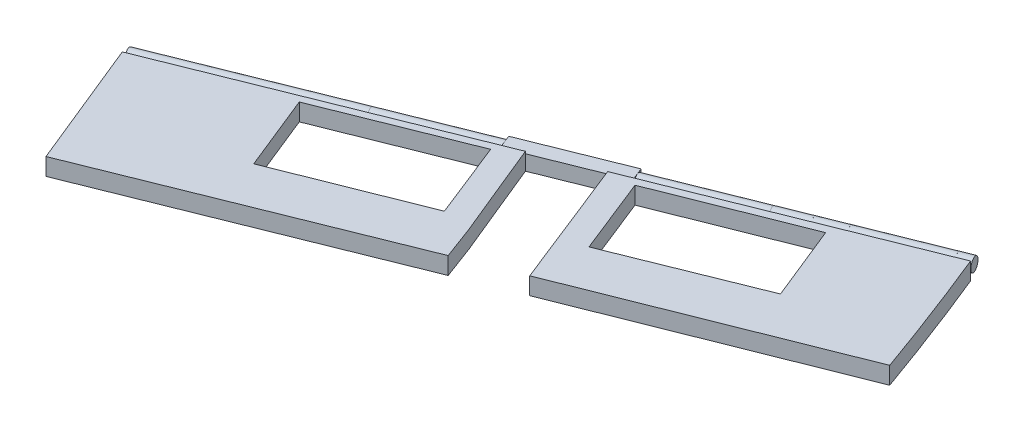
ISO-10303-21;
HEADER;
FILE_DESCRIPTION(('STEP AP214'),'2;1');
FILE_NAME('part.step','',(''),(''),'','','');
FILE_SCHEMA(('AUTOMOTIVE_DESIGN { 1 0 10303 214 1 1 1 1 }'));
ENDSEC;
DATA;
#1=APPLICATION_CONTEXT('core data for automotive mechanical design processes');
#2=APPLICATION_PROTOCOL_DEFINITION('international standard','automotive_design',2000,#1);
#3=PRODUCT_CONTEXT('',#1,'mechanical');
#4=PRODUCT('Part','Part','',(#3));
#5=PRODUCT_RELATED_PRODUCT_CATEGORY('part','',(#4));
#6=PRODUCT_DEFINITION_FORMATION('','',#4);
#7=PRODUCT_DEFINITION_CONTEXT('part definition',#1,'design');
#8=PRODUCT_DEFINITION('design','',#6,#7);
#9=PRODUCT_DEFINITION_SHAPE('','',#8);
#10=(LENGTH_UNIT() NAMED_UNIT(*) SI_UNIT(.MILLI.,.METRE.));
#11=(NAMED_UNIT(*) PLANE_ANGLE_UNIT() SI_UNIT($,.RADIAN.));
#12=(NAMED_UNIT(*) SI_UNIT($,.STERADIAN.) SOLID_ANGLE_UNIT());
#13=UNCERTAINTY_MEASURE_WITH_UNIT(LENGTH_MEASURE(1.E-05),#10,'distance_accuracy_value','');
#14=(GEOMETRIC_REPRESENTATION_CONTEXT(3) GLOBAL_UNCERTAINTY_ASSIGNED_CONTEXT((#13)) GLOBAL_UNIT_ASSIGNED_CONTEXT((#10,
#11,#12)) REPRESENTATION_CONTEXT('',''));
#15=CARTESIAN_POINT('',(0.,0.,0.));
#16=DIRECTION('',(0.,0.,1.));
#17=DIRECTION('',(1.,0.,0.));
#18=AXIS2_PLACEMENT_3D('',#15,#16,#17);
#19=CARTESIAN_POINT('',(29.8203541317368,0.690000000000001,-19.1612815138504));
#20=DIRECTION('',(0.927983740389584,0.,-0.372620688599758));
#21=DIRECTION('',(0.372620688599758,0.,0.927983740389584));
#22=AXIS2_PLACEMENT_3D('',#19,#20,#21);
#23=PLANE('',#22);
#24=CARTESIAN_POINT('',(29.8203520928021,0.689950666830874,-19.1612865916637));
#25=DIRECTION('',(0.927983740389584,0.,-0.372620688599758));
#26=DIRECTION('',(-0.372620688599758,0.,-0.927983740389584));
#27=AXIS2_PLACEMENT_3D('',#24,#25,#26);
#28=CIRCLE('',#27,0.374949635800202);
#29=CARTESIAN_POINT('',(29.835791302973,1.06260391466458,-19.1228364023924));
#30=VERTEX_POINT('',#29);
#31=CARTESIAN_POINT('',(29.8049498871679,0.317285657624517,-19.1996446242154));
#32=VERTEX_POINT('',#31);
#33=EDGE_CURVE('P0_E62',#30,#32,#28,.T.);
#34=ORIENTED_EDGE('',*,*,#33,.F.);
#35=CARTESIAN_POINT('',(29.8357542686036,1.06261495198308,-19.1229286336982));
#36=DIRECTION('',(0.927983740389584,0.,-0.372620688599758));
#37=DIRECTION('',(-0.372620688599758,0.,-0.927983740389584));
#38=AXIS2_PLACEMENT_3D('',#35,#36,#37);
#39=CIRCLE('',#38,9.99999034466496E-05);
#40=CARTESIAN_POINT('',(29.8357172331386,1.06262596279394,-19.1230208677324));
#41=VERTEX_POINT('',#40);
#42=EDGE_CURVE('P0_E88',#30,#41,#39,.T.);
#43=ORIENTED_EDGE('',*,*,#42,.T.);
#44=EDGE_CURVE('P0_E12',#32,#41,#28,.T.);
#45=ORIENTED_EDGE('',*,*,#44,.F.);
#46=CARTESIAN_POINT('',(29.8203541317368,0.690000000000001,-19.1612815138504));
#47=DIRECTION('',(0.927983740389584,0.,-0.372620688599758));
#48=DIRECTION('',(0.372620688599758,0.,0.927983740389584));
#49=AXIS2_PLACEMENT_3D('',#46,#47,#48);
#50=CIRCLE('',#49,0.375);
#51=EDGE_CURVE('P0_E60',#32,#32,#50,.T.);
#52=ORIENTED_EDGE('',*,*,#51,.T.);
#53=EDGE_LOOP('',(#34,#43,#45,#52));
#54=FACE_BOUND('',#53,.T.);
#55=ADVANCED_FACE('P0_F51',(#54),#23,.T.);
#56=CARTESIAN_POINT('',(29.8203541317368,0.690000000000001,-19.1612815138504));
#57=DIRECTION('',(-0.927983740389584,0.,0.372620688599758));
#58=DIRECTION('',(-0.372620688599758,0.,-0.927983740389584));
#59=AXIS2_PLACEMENT_3D('',#56,#57,#58);
#60=CYLINDRICAL_SURFACE('',#59,0.375);
#61=ORIENTED_EDGE('',*,*,#51,.F.);
#62=EDGE_LOOP('',(#61));
#63=FACE_BOUND('',#62,.T.);
#64=CARTESIAN_POINT('',(24.2524516893993,0.690000000000001,-16.9255573822519));
#65=DIRECTION('',(0.927983740389584,0.,-0.372620688599758));
#66=DIRECTION('',(0.372620688599758,0.,0.927983740389584));
#67=AXIS2_PLACEMENT_3D('',#64,#65,#66);
#68=CIRCLE('',#67,0.375);
#69=CARTESIAN_POINT('',(24.3921844476242,0.690000000000001,-16.5775634796058));
#70=VERTEX_POINT('',#69);
#71=EDGE_CURVE('P0_E55',#70,#70,#68,.T.);
#72=ORIENTED_EDGE('',*,*,#71,.T.);
#73=EDGE_LOOP('',(#72));
#74=FACE_BOUND('',#73,.T.);
#75=ADVANCED_FACE('P0_F53',(#63,#74),#60,.T.);
#76=CARTESIAN_POINT('',(24.2524516893993,0.690000000000001,-16.9255573822519));
#77=DIRECTION('',(0.927983740389584,0.,-0.372620688599758));
#78=DIRECTION('',(0.372620688599758,0.,0.927983740389584));
#79=AXIS2_PLACEMENT_3D('',#76,#77,#78);
#80=PLANE('',#79);
#81=ORIENTED_EDGE('',*,*,#71,.F.);
#82=EDGE_LOOP('',(#81));
#83=FACE_BOUND('',#82,.T.);
#84=ADVANCED_FACE('P0_F106',(#83),#80,.F.);
#85=CARTESIAN_POINT('',(38.2033836556964,1.06261495198308,-22.4828493828022));
#86=DIRECTION('',(-0.927983740389584,0.,0.372620688599758));
#87=DIRECTION('',(0.372620688599758,0.,0.927983740389584));
#88=AXIS2_PLACEMENT_3D('',#85,#86,#87);
#89=CYLINDRICAL_SURFACE('',#88,9.99999034466496E-05);
#90=ORIENTED_EDGE('',*,*,#42,.F.);
#91=DIRECTION('',(-0.927983740389584,0.,0.372620688599758));
#92=VECTOR('',#91,1.);
#93=CARTESIAN_POINT('',(38.2034206900659,1.06260391466458,-22.4827571514964));
#94=LINE('',#93,#92);
#95=CARTESIAN_POINT('',(38.2034206900659,1.06260391466458,-22.4827571514964));
#96=VERTEX_POINT('',#95);
#97=EDGE_CURVE('P0_E82',#96,#30,#94,.T.);
#98=ORIENTED_EDGE('',*,*,#97,.F.);
#99=CARTESIAN_POINT('',(38.2033836556964,1.06261495198308,-22.4828493828022));
#100=DIRECTION('',(0.927983740389584,0.,-0.372620688599758));
#101=DIRECTION('',(-0.372620688599758,0.,-0.927983740389584));
#102=AXIS2_PLACEMENT_3D('',#99,#100,#101);
#103=CIRCLE('',#102,9.99999034466496E-05);
#104=CARTESIAN_POINT('',(38.2033466202314,1.06262596279394,-22.4829416168364));
#105=VERTEX_POINT('',#104);
#106=EDGE_CURVE('P0_E87',#96,#105,#103,.T.);
#107=ORIENTED_EDGE('',*,*,#106,.T.);
#108=DIRECTION('',(-0.927983740389584,0.,0.372620688599758));
#109=VECTOR('',#108,1.);
#110=CARTESIAN_POINT('',(38.2033466202314,1.06262596279394,-22.4829416168364));
#111=LINE('',#110,#109);
#112=EDGE_CURVE('P0_E90',#105,#41,#111,.T.);
#113=ORIENTED_EDGE('',*,*,#112,.T.);
#114=EDGE_LOOP('',(#90,#98,#107,#113));
#115=FACE_BOUND('',#114,.T.);
#116=ADVANCED_FACE('P0_F84',(#115),#89,.F.);
#117=CARTESIAN_POINT('',(38.187981479895,0.689950666830874,-22.5212073407677));
#118=DIRECTION('',(-0.927983740389584,0.,0.372620688599758));
#119=DIRECTION('',(0.372620688599758,0.,0.927983740389584));
#120=AXIS2_PLACEMENT_3D('',#117,#118,#119);
#121=CYLINDRICAL_SURFACE('',#120,0.374949635800202);
#122=ORIENTED_EDGE('',*,*,#33,.T.);
#123=ORIENTED_EDGE('',*,*,#44,.T.);
#124=ORIENTED_EDGE('',*,*,#112,.F.);
#125=CARTESIAN_POINT('',(38.187981479895,0.689950666830874,-22.5212073407677));
#126=DIRECTION('',(0.927983740389584,0.,-0.372620688599758));
#127=DIRECTION('',(-0.372620688599758,0.,-0.927983740389584));
#128=AXIS2_PLACEMENT_3D('',#125,#126,#127);
#129=CIRCLE('',#128,0.374949635800202);
#130=EDGE_CURVE('P0_E93',#96,#105,#129,.T.);
#131=ORIENTED_EDGE('',*,*,#130,.F.);
#132=ORIENTED_EDGE('',*,*,#97,.T.);
#133=EDGE_LOOP('',(#122,#123,#124,#131,#132));
#134=FACE_BOUND('',#133,.T.);
#135=ADVANCED_FACE('P0_F94',(#134),#121,.T.);
#136=CARTESIAN_POINT('',(40.67324308042,0.,-16.3318506398062));
#137=DIRECTION('',(0.927983740389584,0.,-0.372620688599758));
#138=DIRECTION('',(-0.372620688599758,0.,-0.927983740389584));
#139=AXIS2_PLACEMENT_3D('',#136,#137,#138);
#140=PLANE('',#139);
#141=ORIENTED_EDGE('',*,*,#106,.F.);
#142=ORIENTED_EDGE('',*,*,#130,.T.);
#143=EDGE_LOOP('',(#141,#142));
#144=FACE_BOUND('',#143,.T.);
#145=ADVANCED_FACE('P0_F97',(#144),#140,.T.);
#146=CLOSED_SHELL('',(#55,#75,#84,#116,#135,#145));
#147=MANIFOLD_SOLID_BREP('P0_B2',#146);
#148=CARTESIAN_POINT('',(18.7773476211007,0.69,-14.7270953195133));
#149=DIRECTION('',(-0.927983740389584,0.,0.372620688599758));
#150=DIRECTION('',(0.372620688599758,0.,0.927983740389584));
#151=AXIS2_PLACEMENT_3D('',#148,#149,#150);
#152=CYLINDRICAL_SURFACE('',#151,0.375);
#153=CARTESIAN_POINT('',(18.7773476211007,0.69,-14.7270953195133));
#154=DIRECTION('',(0.927983740389584,0.,-0.372620688599758));
#155=DIRECTION('',(-0.372620688599758,0.,-0.927983740389584));
#156=AXIS2_PLACEMENT_3D('',#153,#154,#155);
#157=CIRCLE('',#156,0.375);
#158=CARTESIAN_POINT('',(18.6376148628758,0.69,-15.0750892221594));
#159=VERTEX_POINT('',#158);
#160=EDGE_CURVE('P0_E171',#159,#159,#157,.T.);
#161=ORIENTED_EDGE('',*,*,#160,.F.);
#162=EDGE_LOOP('',(#161));
#163=FACE_BOUND('',#162,.T.);
#164=CARTESIAN_POINT('',(13.2094451787632,0.69,-12.4913711879148));
#165=DIRECTION('',(0.927983740389584,0.,-0.372620688599758));
#166=DIRECTION('',(-0.372620688599758,0.,-0.927983740389584));
#167=AXIS2_PLACEMENT_3D('',#164,#165,#166);
#168=CIRCLE('',#167,0.375);
#169=CARTESIAN_POINT('',(13.1202450147183,0.401349071453369,-12.7135174734645));
#170=VERTEX_POINT('',#169);
#171=EDGE_CURVE('P0_E166',#170,#170,#168,.T.);
#172=ORIENTED_EDGE('',*,*,#171,.T.);
#173=EDGE_LOOP('',(#172));
#174=FACE_BOUND('',#173,.T.);
#175=ADVANCED_FACE('P0_F163',(#163,#174),#152,.T.);
#176=CARTESIAN_POINT('',(18.7773476211007,0.69,-14.7270953195133));
#177=DIRECTION('',(0.927983740389584,0.,-0.372620688599758));
#178=DIRECTION('',(-0.372620688599758,0.,-0.927983740389584));
#179=AXIS2_PLACEMENT_3D('',#176,#177,#178);
#180=PLANE('',#179);
#181=ORIENTED_EDGE('',*,*,#160,.T.);
#182=EDGE_LOOP('',(#181));
#183=FACE_BOUND('',#182,.T.);
#184=ADVANCED_FACE('P0_F219',(#183),#180,.T.);
#185=CARTESIAN_POINT('',(13.2094451787632,0.69,-12.4913711879148));
#186=DIRECTION('',(0.927983740389584,0.,-0.372620688599758));
#187=DIRECTION('',(-0.372620688599758,0.,-0.927983740389584));
#188=AXIS2_PLACEMENT_3D('',#185,#186,#187);
#189=PLANE('',#188);
#190=CARTESIAN_POINT('',(13.2094334855968,0.68996216101855,-12.4914003088645));
#191=DIRECTION('',(-0.927983740389584,0.,0.372620688599758));
#192=DIRECTION('',(0.372620688599758,0.,0.927983740389584));
#193=AXIS2_PLACEMENT_3D('',#190,#191,#192);
#194=CIRCLE('',#193,0.37494915862525);
#195=CARTESIAN_POINT('',(13.2985928710954,0.978637781023837,-12.2693555792584));
#196=VERTEX_POINT('',#195);
#197=EDGE_CURVE('P0_E173',#196,#170,#194,.T.);
#198=ORIENTED_EDGE('',*,*,#197,.F.);
#199=CARTESIAN_POINT('',(13.2986215561663,0.978573955141176,-12.2692841412513));
#200=DIRECTION('',(-0.927983740389584,0.,0.372620688599758));
#201=DIRECTION('',(0.372620688599758,0.,0.927983740389584));
#202=AXIS2_PLACEMENT_3D('',#199,#200,#201);
#203=CIRCLE('',#202,9.99998272511914E-05);
#204=CARTESIAN_POINT('',(13.2986502348932,0.978510108729513,-12.2692127190433));
#205=VERTEX_POINT('',#204);
#206=EDGE_CURVE('P0_E200',#196,#205,#203,.T.);
#207=ORIENTED_EDGE('',*,*,#206,.T.);
#208=EDGE_CURVE('P0_E49',#170,#205,#194,.T.);
#209=ORIENTED_EDGE('',*,*,#208,.F.);
#210=ORIENTED_EDGE('',*,*,#171,.F.);
#211=EDGE_LOOP('',(#198,#207,#209,#210));
#212=FACE_BOUND('',#211,.T.);
#213=ADVANCED_FACE('P0_F217',(#212),#189,.F.);
#214=CARTESIAN_POINT('',(3.28103707866071,0.978573955141176,-8.24684380781687));
#215=DIRECTION('',(0.927983740389584,0.,-0.372620688599758));
#216=DIRECTION('',(-0.372620688599758,0.,-0.927983740389584));
#217=AXIS2_PLACEMENT_3D('',#214,#215,#216);
#218=CYLINDRICAL_SURFACE('',#217,9.99998272511914E-05);
#219=ORIENTED_EDGE('',*,*,#206,.F.);
#220=DIRECTION('',(0.927983740389584,0.,-0.372620688599758));
#221=VECTOR('',#220,1.);
#222=CARTESIAN_POINT('',(3.2810083935898,0.978637781023837,-8.24691524582398));
#223=LINE('',#222,#221);
#224=CARTESIAN_POINT('',(3.2810083935898,0.978637781023837,-8.24691524582398));
#225=VERTEX_POINT('',#224);
#226=EDGE_CURVE('P0_E194',#225,#196,#223,.T.);
#227=ORIENTED_EDGE('',*,*,#226,.F.);
#228=CARTESIAN_POINT('',(3.28103707866071,0.978573955141176,-8.24684380781687));
#229=DIRECTION('',(-0.927983740389584,0.,0.372620688599758));
#230=DIRECTION('',(0.372620688599758,0.,0.927983740389584));
#231=AXIS2_PLACEMENT_3D('',#228,#229,#230);
#232=CIRCLE('',#231,9.99998272511914E-05);
#233=CARTESIAN_POINT('',(3.28106575738766,0.978510108729513,-8.24677238560892));
#234=VERTEX_POINT('',#233);
#235=EDGE_CURVE('P0_E199',#225,#234,#232,.T.);
#236=ORIENTED_EDGE('',*,*,#235,.T.);
#237=DIRECTION('',(0.927983740389584,0.,-0.372620688599758));
#238=VECTOR('',#237,1.);
#239=CARTESIAN_POINT('',(3.28106575738766,0.978510108729513,-8.24677238560892));
#240=LINE('',#239,#238);
#241=EDGE_CURVE('P0_E202',#234,#205,#240,.T.);
#242=ORIENTED_EDGE('',*,*,#241,.T.);
#243=EDGE_LOOP('',(#219,#227,#236,#242));
#244=FACE_BOUND('',#243,.T.);
#245=ADVANCED_FACE('P0_F196',(#244),#218,.F.);
#246=CARTESIAN_POINT('',(3.19184900809124,0.68996216101855,-8.46895997543012));
#247=DIRECTION('',(0.927983740389584,0.,-0.372620688599758));
#248=DIRECTION('',(-0.372620688599758,0.,-0.927983740389584));
#249=AXIS2_PLACEMENT_3D('',#246,#247,#248);
#250=CYLINDRICAL_SURFACE('',#249,0.37494915862525);
#251=ORIENTED_EDGE('',*,*,#197,.T.);
#252=ORIENTED_EDGE('',*,*,#208,.T.);
#253=ORIENTED_EDGE('',*,*,#241,.F.);
#254=CARTESIAN_POINT('',(3.19184900809124,0.68996216101855,-8.46895997543012));
#255=DIRECTION('',(-0.927983740389584,0.,0.372620688599758));
#256=DIRECTION('',(0.372620688599758,0.,0.927983740389584));
#257=AXIS2_PLACEMENT_3D('',#254,#255,#256);
#258=CIRCLE('',#257,0.37494915862525);
#259=EDGE_CURVE('P0_E205',#225,#234,#258,.T.);
#260=ORIENTED_EDGE('',*,*,#259,.F.);
#261=ORIENTED_EDGE('',*,*,#226,.T.);
#262=EDGE_LOOP('',(#251,#252,#253,#260,#261));
#263=FACE_BOUND('',#262,.T.);
#264=ADVANCED_FACE('P0_F206',(#263),#250,.T.);
#265=CARTESIAN_POINT('',(5.67712026284796,0.,-2.27957923133218));
#266=DIRECTION('',(-0.927983740389584,0.,0.372620688599758));
#267=DIRECTION('',(0.372620688599758,0.,0.927983740389584));
#268=AXIS2_PLACEMENT_3D('',#265,#266,#267);
#269=PLANE('',#268);
#270=ORIENTED_EDGE('',*,*,#235,.F.);
#271=ORIENTED_EDGE('',*,*,#259,.T.);
#272=EDGE_LOOP('',(#270,#271));
#273=FACE_BOUND('',#272,.T.);
#274=ADVANCED_FACE('P0_F209',(#273),#269,.T.);
#275=CLOSED_SHELL('',(#175,#184,#213,#245,#264,#274));
#276=MANIFOLD_SOLID_BREP('P0_B6',#275);
#277=CARTESIAN_POINT('',(18.9636579654006,0.19,-14.2631034493185));
#278=DIRECTION('',(0.927983740389584,0.,-0.372620688599757));
#279=DIRECTION('',(0.372620688599757,0.,0.927983740389584));
#280=AXIS2_PLACEMENT_3D('',#277,#278,#279);
#281=PLANE('',#280);
#282=DIRECTION('',(-0.372620688599757,0.,-0.927983740389584));
#283=VECTOR('',#282,1.);
#284=CARTESIAN_POINT('',(18.9636579654006,1.065,-14.2631034493185));
#285=LINE('',#284,#283);
#286=CARTESIAN_POINT('',(18.9636579654006,1.065,-14.2631034493185));
#287=VERTEX_POINT('',#286);
#288=CARTESIAN_POINT('',(18.6376148628758,1.065,-15.0750892221594));
#289=VERTEX_POINT('',#288);
#290=EDGE_CURVE('P1_E79',#287,#289,#285,.T.);
#291=ORIENTED_EDGE('',*,*,#290,.T.);
#292=DIRECTION('',(0.,1.,0.));
#293=VECTOR('',#292,1.);
#294=CARTESIAN_POINT('',(18.6376148628758,0.19,-15.0750892221594));
#295=LINE('',#294,#293);
#296=CARTESIAN_POINT('',(18.6376148628758,0.19,-15.0750892221594));
#297=VERTEX_POINT('',#296);
#298=EDGE_CURVE('P1_E11',#297,#289,#295,.T.);
#299=ORIENTED_EDGE('',*,*,#298,.F.);
#300=DIRECTION('',(-0.372620688599757,0.,-0.927983740389584));
#301=VECTOR('',#300,1.);
#302=CARTESIAN_POINT('',(18.9636579654006,0.19,-14.2631034493185));
#303=LINE('',#302,#301);
#304=CARTESIAN_POINT('',(18.9636579654006,0.19,-14.2631034493185));
#305=VERTEX_POINT('',#304);
#306=EDGE_CURVE('P1_E67',#305,#297,#303,.T.);
#307=ORIENTED_EDGE('',*,*,#306,.F.);
#308=DIRECTION('',(0.,1.,0.));
#309=VECTOR('',#308,1.);
#310=CARTESIAN_POINT('',(18.9636579654006,0.19,-14.2631034493185));
#311=LINE('',#310,#309);
#312=EDGE_CURVE('P1_E75',#305,#287,#311,.T.);
#313=ORIENTED_EDGE('',*,*,#312,.T.);
#314=EDGE_LOOP('',(#291,#299,#307,#313));
#315=FACE_BOUND('',#314,.T.);
#316=ADVANCED_FACE('P1_F16',(#315),#281,.F.);
#317=CARTESIAN_POINT('',(18.6376148628758,0.19,-15.0750892221594));
#318=DIRECTION('',(0.372620688599758,0.,0.927983740389584));
#319=DIRECTION('',(-0.927983740389584,0.,0.372620688599758));
#320=AXIS2_PLACEMENT_3D('',#317,#318,#319);
#321=PLANE('',#320);
#322=DIRECTION('',(0.927983740389584,0.,-0.372620688599758));
#323=VECTOR('',#322,1.);
#324=CARTESIAN_POINT('',(18.6376148628758,1.065,-15.0750892221594));
#325=LINE('',#324,#323);
#326=CARTESIAN_POINT('',(24.1127189311744,1.065,-17.273551284898));
#327=VERTEX_POINT('',#326);
#328=EDGE_CURVE('P1_E71',#289,#327,#325,.T.);
#329=ORIENTED_EDGE('',*,*,#328,.T.);
#330=DIRECTION('',(0.,1.,0.));
#331=VECTOR('',#330,1.);
#332=CARTESIAN_POINT('',(24.1127189311744,0.19,-17.273551284898));
#333=LINE('',#332,#331);
#334=CARTESIAN_POINT('',(24.1127189311744,0.19,-17.273551284898));
#335=VERTEX_POINT('',#334);
#336=EDGE_CURVE('P1_E24',#335,#327,#333,.T.);
#337=ORIENTED_EDGE('',*,*,#336,.F.);
#338=DIRECTION('',(0.927983740389584,0.,-0.372620688599758));
#339=VECTOR('',#338,1.);
#340=CARTESIAN_POINT('',(18.6376148628758,0.19,-15.0750892221594));
#341=LINE('',#340,#339);
#342=EDGE_CURVE('P1_E62',#297,#335,#341,.T.);
#343=ORIENTED_EDGE('',*,*,#342,.F.);
#344=ORIENTED_EDGE('',*,*,#298,.T.);
#345=EDGE_LOOP('',(#329,#337,#343,#344));
#346=FACE_BOUND('',#345,.T.);
#347=ADVANCED_FACE('P1_F70',(#346),#321,.F.);
#348=CARTESIAN_POINT('',(24.4387620336992,0.19,-16.4615655120571));
#349=DIRECTION('',(-0.927983740389584,0.,0.372620688599758));
#350=DIRECTION('',(-0.372620688599758,0.,-0.927983740389584));
#351=AXIS2_PLACEMENT_3D('',#348,#349,#350);
#352=PLANE('',#351);
#353=DIRECTION('',(0.372620688599758,0.,0.927983740389584));
#354=VECTOR('',#353,1.);
#355=CARTESIAN_POINT('',(24.4387620336992,1.065,-16.4615655120571));
#356=LINE('',#355,#354);
#357=CARTESIAN_POINT('',(24.4387620336992,1.065,-16.4615655120571));
#358=VERTEX_POINT('',#357);
#359=EDGE_CURVE('P1_E49',#327,#358,#356,.T.);
#360=ORIENTED_EDGE('',*,*,#359,.T.);
#361=DIRECTION('',(0.,1.,0.));
#362=VECTOR('',#361,1.);
#363=CARTESIAN_POINT('',(24.4387620336992,0.19,-16.4615655120571));
#364=LINE('',#363,#362);
#365=CARTESIAN_POINT('',(24.4387620336992,0.19,-16.4615655120571));
#366=VERTEX_POINT('',#365);
#367=EDGE_CURVE('P1_E72',#366,#358,#364,.T.);
#368=ORIENTED_EDGE('',*,*,#367,.F.);
#369=DIRECTION('',(0.372620688599758,0.,0.927983740389584));
#370=VECTOR('',#369,1.);
#371=CARTESIAN_POINT('',(24.4387620336992,0.19,-16.4615655120571));
#372=LINE('',#371,#370);
#373=EDGE_CURVE('P1_E65',#335,#366,#372,.T.);
#374=ORIENTED_EDGE('',*,*,#373,.F.);
#375=ORIENTED_EDGE('',*,*,#336,.T.);
#376=EDGE_LOOP('',(#360,#368,#374,#375));
#377=FACE_BOUND('',#376,.T.);
#378=ADVANCED_FACE('P1_F73',(#377),#352,.F.);
#379=CARTESIAN_POINT('',(18.9636579654006,0.19,-14.2631034493185));
#380=DIRECTION('',(-0.372620688599758,0.,-0.927983740389584));
#381=DIRECTION('',(0.927983740389584,0.,-0.372620688599758));
#382=AXIS2_PLACEMENT_3D('',#379,#380,#381);
#383=PLANE('',#382);
#384=DIRECTION('',(-0.927983740389584,0.,0.372620688599758));
#385=VECTOR('',#384,1.);
#386=CARTESIAN_POINT('',(18.9636579654006,1.065,-14.2631034493185));
#387=LINE('',#386,#385);
#388=EDGE_CURVE('P1_E55',#358,#287,#387,.T.);
#389=ORIENTED_EDGE('',*,*,#388,.T.);
#390=ORIENTED_EDGE('',*,*,#312,.F.);
#391=DIRECTION('',(-0.927983740389584,0.,0.372620688599758));
#392=VECTOR('',#391,1.);
#393=CARTESIAN_POINT('',(18.9636579654006,0.19,-14.2631034493185));
#394=LINE('',#393,#392);
#395=EDGE_CURVE('P1_E32',#366,#305,#394,.T.);
#396=ORIENTED_EDGE('',*,*,#395,.F.);
#397=ORIENTED_EDGE('',*,*,#367,.T.);
#398=EDGE_LOOP('',(#389,#390,#396,#397));
#399=FACE_BOUND('',#398,.T.);
#400=ADVANCED_FACE('P1_F86',(#399),#383,.F.);
#401=CARTESIAN_POINT('',(18.9636579654006,0.19,-14.2631034493185));
#402=DIRECTION('',(0.,-1.,0.));
#403=DIRECTION('',(-0.372620688599758,0.,-0.927983740389584));
#404=AXIS2_PLACEMENT_3D('',#401,#402,#403);
#405=PLANE('',#404);
#406=ORIENTED_EDGE('',*,*,#306,.T.);
#407=ORIENTED_EDGE('',*,*,#342,.T.);
#408=ORIENTED_EDGE('',*,*,#373,.T.);
#409=ORIENTED_EDGE('',*,*,#395,.T.);
#410=EDGE_LOOP('',(#406,#407,#408,#409));
#411=FACE_BOUND('',#410,.T.);
#412=ADVANCED_FACE('P1_F63',(#411),#405,.T.);
#413=CARTESIAN_POINT('',(18.9636579654006,1.065,-14.2631034493185));
#414=DIRECTION('',(0.,-1.,0.));
#415=DIRECTION('',(-0.372620688599758,0.,-0.927983740389584));
#416=AXIS2_PLACEMENT_3D('',#413,#414,#415);
#417=PLANE('',#416);
#418=ORIENTED_EDGE('',*,*,#290,.F.);
#419=ORIENTED_EDGE('',*,*,#388,.F.);
#420=ORIENTED_EDGE('',*,*,#359,.F.);
#421=ORIENTED_EDGE('',*,*,#328,.F.);
#422=EDGE_LOOP('',(#418,#419,#420,#421));
#423=FACE_BOUND('',#422,.T.);
#424=ADVANCED_FACE('P1_F89',(#423),#417,.F.);
#425=CLOSED_SHELL('',(#316,#347,#378,#400,#412,#424));
#426=MANIFOLD_SOLID_BREP('P1_B1',#425);
#427=CARTESIAN_POINT('',(35.9788581902602,1.19,-26.9467232131162));
#428=DIRECTION('',(0.,-1.,0.));
#429=DIRECTION('',(0.,0.,-1.));
#430=AXIS2_PLACEMENT_3D('',#427,#428,#429);
#431=PLANE('',#430);
#432=DIRECTION('',(-0.929138932775586,0.,0.369730771779472));
#433=VECTOR('',#432,1.);
#434=CARTESIAN_POINT('',(24.8826001834326,1.19,-16.1536096345668));
#435=LINE('',#434,#433);
#436=CARTESIAN_POINT('',(32.786623966637,1.19,-19.2988451966992));
#437=VERTEX_POINT('',#436);
#438=CARTESIAN_POINT('',(24.8826001834326,1.19,-16.1536096345668));
#439=VERTEX_POINT('',#438);
#440=EDGE_CURVE('P2_E100',#437,#439,#435,.T.);
#441=ORIENTED_EDGE('',*,*,#440,.F.);
#442=DIRECTION('',(-0.374554351369243,0.,-0.927204960011737));
#443=VECTOR('',#442,1.);
#444=CARTESIAN_POINT('',(32.786623966637,1.19,-19.2988451966992));
#445=LINE('',#444,#443);
#446=CARTESIAN_POINT('',(34.559807217706,1.19,-14.9093505895999));
#447=VERTEX_POINT('',#446);
#448=EDGE_CURVE('P2_E175',#447,#437,#445,.T.);
#449=ORIENTED_EDGE('',*,*,#448,.F.);
#450=DIRECTION('',(0.927574779548119,0.,-0.3736375628149));
#451=VECTOR('',#450,1.);
#452=CARTESIAN_POINT('',(34.559807217706,1.19,-14.9093505895999));
#453=LINE('',#452,#451);
#454=CARTESIAN_POINT('',(26.6479258883437,1.19,-11.7223557269067));
#455=VERTEX_POINT('',#454);
#456=EDGE_CURVE('P2_E182',#455,#447,#453,.T.);
#457=ORIENTED_EDGE('',*,*,#456,.F.);
#458=DIRECTION('',(0.370093426325255,0.,0.928994540237365));
#459=VECTOR('',#458,1.);
#460=CARTESIAN_POINT('',(26.6479258883437,1.19,-11.7223557269067));
#461=LINE('',#460,#459);
#462=EDGE_CURVE('P2_E186',#439,#455,#461,.T.);
#463=ORIENTED_EDGE('',*,*,#462,.F.);
#464=EDGE_LOOP('',(#441,#449,#457,#463));
#465=FACE_BOUND('',#464,.T.);
#466=CARTESIAN_POINT('',(41.3064860387741,1.19,-14.4944209133861));
#467=CARTESIAN_POINT('',(40.4413769049084,1.19,-16.9603625473752));
#468=CARTESIAN_POINT('',(38.8653273947854,1.19,-21.0390813626115));
#469=CARTESIAN_POINT('',(38.2178251849978,1.19,-22.5309199781212));
#470=CARTESIAN_POINT('',(37.5641807720796,1.19,-24.0369101682144));
#471=CARTESIAN_POINT('',(36.7438854848778,1.19,-25.4649666392258));
#472=CARTESIAN_POINT('',(35.9992618023672,1.19,-26.9281115543455));
#473=CARTESIAN_POINT('',(35.9910572987333,1.19,-26.9442329564106));
#474=CARTESIAN_POINT('',(35.9659381842422,1.19,-26.9489216293106));
#475=CARTESIAN_POINT('',(35.9606172707881,1.19,-26.9662103934202));
#476=CARTESIAN_POINT('',(35.7688797215146,1.19,-27.5892059164559));
#477=CARTESIAN_POINT('',(35.6349446760462,1.19,-28.230797201937));
#478=CARTESIAN_POINT('',(35.4100442098563,1.19,-28.8426031269095));
#479=CARTESIAN_POINT('',(35.2164658014839,1.19,-29.3692023785491));
#480=CARTESIAN_POINT('',(34.9423080858761,1.19,-29.8625739139352));
#481=CARTESIAN_POINT('',(34.7084400238859,1.19,-30.3725593074478));
#482=B_SPLINE_CURVE_WITH_KNOTS('',3,(#466,#467,#468,#469,#470,#471,#472,#473,#474,#475,#476,
#477,#478,#479,#480,#481),.UNSPECIFIED.,.F.,.F.,(4,3,3,3,3,4),(0.,1.,2.,3.,4.,5.),.UNSPECIFIED.);
#483=CARTESIAN_POINT('',(41.3064860387741,1.19,-14.4944209133861));
#484=VERTEX_POINT('',#483);
#485=CARTESIAN_POINT('',(38.4122924399624,1.19,-22.0724682633881));
#486=VERTEX_POINT('',#485);
#487=EDGE_CURVE('P2_E108',#484,#486,#482,.T.);
#488=ORIENTED_EDGE('',*,*,#487,.T.);
#489=DIRECTION('',(-0.927983740389584,0.,0.372620688599758));
#490=VECTOR('',#489,1.);
#491=CARTESIAN_POINT('',(38.0021800655158,1.19,-21.9077925813591));
#492=LINE('',#491,#490);
#493=CARTESIAN_POINT('',(23.4067210466264,1.19,-16.0471618899583));
#494=VERTEX_POINT('',#493);
#495=EDGE_CURVE('P2_E96',#486,#494,#492,.T.);
#496=ORIENTED_EDGE('',*,*,#495,.T.);
#497=DIRECTION('',(0.36884552030541,0.,0.929490711169634));
#498=VECTOR('',#497,1.);
#499=CARTESIAN_POINT('',(26.3793084328849,1.19,-8.55624167658697));
#500=LINE('',#499,#498);
#501=CARTESIAN_POINT('',(26.3793084328849,1.19,-8.55624167658697));
#502=VERTEX_POINT('',#501);
#503=EDGE_CURVE('P2_E153',#494,#502,#500,.T.);
#504=ORIENTED_EDGE('',*,*,#503,.T.);
#505=DIRECTION('',(0.929176749845426,0.,-0.369635722768635));
#506=VECTOR('',#505,1.);
#507=CARTESIAN_POINT('',(41.3064860387741,1.19,-14.4944209133861));
#508=LINE('',#507,#506);
#509=EDGE_CURVE('P2_E113',#502,#484,#508,.T.);
#510=ORIENTED_EDGE('',*,*,#509,.T.);
#511=EDGE_LOOP('',(#488,#496,#504,#510));
#512=FACE_BOUND('',#511,.T.);
#513=ADVANCED_FACE('P2_F16',(#465,#512),#431,.F.);
#514=CARTESIAN_POINT('',(26.3793084328849,1.19,-8.55624167658697));
#515=DIRECTION('',(0.929490711169634,0.,-0.36884552030541));
#516=DIRECTION('',(-0.36884552030541,0.,-0.929490711169634));
#517=AXIS2_PLACEMENT_3D('',#514,#515,#516);
#518=PLANE('',#517);
#519=DIRECTION('',(0.,-1.,0.));
#520=VECTOR('',#519,1.);
#521=CARTESIAN_POINT('',(23.4067210466264,1.19,-16.0471618899583));
#522=LINE('',#521,#520);
#523=CARTESIAN_POINT('',(23.4067210466264,0.19,-16.0471618899583));
#524=VERTEX_POINT('',#523);
#525=EDGE_CURVE('P2_E103',#494,#524,#522,.T.);
#526=ORIENTED_EDGE('',*,*,#525,.T.);
#527=DIRECTION('',(0.36884552030541,0.,0.929490711169634));
#528=VECTOR('',#527,1.);
#529=CARTESIAN_POINT('',(26.3793084328849,0.19,-8.55624167658697));
#530=LINE('',#529,#528);
#531=CARTESIAN_POINT('',(26.3793084328849,0.19,-8.55624167658697));
#532=VERTEX_POINT('',#531);
#533=EDGE_CURVE('P2_E39',#524,#532,#530,.T.);
#534=ORIENTED_EDGE('',*,*,#533,.T.);
#535=DIRECTION('',(0.,-1.,0.));
#536=VECTOR('',#535,1.);
#537=CARTESIAN_POINT('',(26.3793084328849,1.19,-8.55624167658697));
#538=LINE('',#537,#536);
#539=EDGE_CURVE('P2_E98',#502,#532,#538,.T.);
#540=ORIENTED_EDGE('',*,*,#539,.F.);
#541=ORIENTED_EDGE('',*,*,#503,.F.);
#542=EDGE_LOOP('',(#526,#534,#540,#541));
#543=FACE_BOUND('',#542,.T.);
#544=ADVANCED_FACE('P2_F140',(#543),#518,.F.);
#545=CARTESIAN_POINT('',(41.3064860387741,1.19,-14.4944209133861));
#546=DIRECTION('',(-0.369635722768635,0.,-0.929176749845426));
#547=DIRECTION('',(-0.929176749845426,0.,0.369635722768635));
#548=AXIS2_PLACEMENT_3D('',#545,#546,#547);
#549=PLANE('',#548);
#550=ORIENTED_EDGE('',*,*,#539,.T.);
#551=DIRECTION('',(0.929176749845426,0.,-0.369635722768635));
#552=VECTOR('',#551,1.);
#553=CARTESIAN_POINT('',(41.3064860387741,0.19,-14.4944209133861));
#554=LINE('',#553,#552);
#555=CARTESIAN_POINT('',(41.3064860387741,0.19,-14.4944209133861));
#556=VERTEX_POINT('',#555);
#557=EDGE_CURVE('P2_E92',#532,#556,#554,.T.);
#558=ORIENTED_EDGE('',*,*,#557,.T.);
#559=DIRECTION('',(0.,-1.,0.));
#560=VECTOR('',#559,1.);
#561=CARTESIAN_POINT('',(41.3064860387741,1.19,-14.4944209133861));
#562=LINE('',#561,#560);
#563=EDGE_CURVE('P2_E91',#484,#556,#562,.T.);
#564=ORIENTED_EDGE('',*,*,#563,.F.);
#565=ORIENTED_EDGE('',*,*,#509,.F.);
#566=EDGE_LOOP('',(#550,#558,#564,#565));
#567=FACE_BOUND('',#566,.T.);
#568=ADVANCED_FACE('P2_F123',(#567),#549,.F.);
#569=DIRECTION('',(0.,-1.,0.));
#570=VECTOR('',#569,1.);
#571=SURFACE_OF_LINEAR_EXTRUSION('',#482,#570);
#572=ORIENTED_EDGE('',*,*,#563,.T.);
#573=CARTESIAN_POINT('',(41.3064860387741,0.19,-14.4944209133861));
#574=CARTESIAN_POINT('',(40.4413769049084,0.19,-16.9603625473752));
#575=CARTESIAN_POINT('',(38.8653273947854,0.19,-21.0390813626115));
#576=CARTESIAN_POINT('',(38.2178251849978,0.19,-22.5309199781212));
#577=CARTESIAN_POINT('',(37.5641807720796,0.19,-24.0369101682144));
#578=CARTESIAN_POINT('',(36.7438854848778,0.19,-25.4649666392258));
#579=CARTESIAN_POINT('',(35.9992618023672,0.19,-26.9281115543455));
#580=CARTESIAN_POINT('',(35.9910572987333,0.19,-26.9442329564106));
#581=CARTESIAN_POINT('',(35.9659381842422,0.19,-26.9489216293106));
#582=CARTESIAN_POINT('',(35.9606172707881,0.19,-26.9662103934202));
#583=CARTESIAN_POINT('',(35.7688797215146,0.19,-27.5892059164559));
#584=CARTESIAN_POINT('',(35.6349446760462,0.19,-28.230797201937));
#585=CARTESIAN_POINT('',(35.4100442098563,0.19,-28.8426031269095));
#586=CARTESIAN_POINT('',(35.2164658014839,0.19,-29.3692023785491));
#587=CARTESIAN_POINT('',(34.9423080858761,0.19,-29.8625739139352));
#588=CARTESIAN_POINT('',(34.7084400238859,0.19,-30.3725593074478));
#589=B_SPLINE_CURVE_WITH_KNOTS('',3,(#573,#574,#575,#576,#577,#578,#579,#580,#581,#582,#583,
#584,#585,#586,#587,#588),.UNSPECIFIED.,.F.,.F.,(4,3,3,3,3,4),(0.,1.,2.,3.,4.,5.),.UNSPECIFIED.);
#590=CARTESIAN_POINT('',(38.4122924399589,0.19,-22.0724682633965));
#591=VERTEX_POINT('',#590);
#592=EDGE_CURVE('P2_E79',#556,#591,#589,.T.);
#593=ORIENTED_EDGE('',*,*,#592,.T.);
#594=DIRECTION('',(0.,-1.,0.));
#595=VECTOR('',#594,1.);
#596=CARTESIAN_POINT('',(38.4122924399589,1.19,-22.0724682633965));
#597=LINE('',#596,#595);
#598=EDGE_CURVE('P2_E88',#591,#486,#597,.F.);
#599=ORIENTED_EDGE('',*,*,#598,.T.);
#600=ORIENTED_EDGE('',*,*,#487,.F.);
#601=EDGE_LOOP('',(#572,#593,#599,#600));
#602=FACE_BOUND('',#601,.T.);
#603=ADVANCED_FACE('P2_F86',(#602),#571,.F.);
#604=CARTESIAN_POINT('',(24.8826001834326,1.19,-16.1536096345668));
#605=DIRECTION('',(0.369730771779472,0.,0.929138932775586));
#606=DIRECTION('',(0.929138932775587,0.,-0.369730771779472));
#607=AXIS2_PLACEMENT_3D('',#604,#605,#606);
#608=PLANE('',#607);
#609=DIRECTION('',(-0.929138932775587,0.,0.369730771779472));
#610=VECTOR('',#609,1.);
#611=CARTESIAN_POINT('',(24.8826001834326,0.19,-16.1536096345668));
#612=LINE('',#611,#610);
#613=CARTESIAN_POINT('',(32.786623966637,0.19,-19.2988451966992));
#614=VERTEX_POINT('',#613);
#615=CARTESIAN_POINT('',(24.8826001834326,0.19,-16.1536096345668));
#616=VERTEX_POINT('',#615);
#617=EDGE_CURVE('P2_E93',#614,#616,#612,.T.);
#618=ORIENTED_EDGE('',*,*,#617,.F.);
#619=DIRECTION('',(0.,-1.,0.));
#620=VECTOR('',#619,1.);
#621=CARTESIAN_POINT('',(32.786623966637,1.19,-19.2988451966992));
#622=LINE('',#621,#620);
#623=EDGE_CURVE('P2_E24',#437,#614,#622,.T.);
#624=ORIENTED_EDGE('',*,*,#623,.F.);
#625=ORIENTED_EDGE('',*,*,#440,.T.);
#626=DIRECTION('',(0.,-1.,0.));
#627=VECTOR('',#626,1.);
#628=CARTESIAN_POINT('',(24.8826001834326,1.19,-16.1536096345668));
#629=LINE('',#628,#627);
#630=EDGE_CURVE('P2_E174',#439,#616,#629,.T.);
#631=ORIENTED_EDGE('',*,*,#630,.T.);
#632=EDGE_LOOP('',(#618,#624,#625,#631));
#633=FACE_BOUND('',#632,.T.);
#634=ADVANCED_FACE('P2_F122',(#633),#608,.T.);
#635=CARTESIAN_POINT('',(26.6479258883437,1.19,-11.7223557269067));
#636=DIRECTION('',(0.928994540237365,0.,-0.370093426325255));
#637=DIRECTION('',(-0.370093426325255,0.,-0.928994540237365));
#638=AXIS2_PLACEMENT_3D('',#635,#636,#637);
#639=PLANE('',#638);
#640=DIRECTION('',(0.370093426325255,0.,0.928994540237365));
#641=VECTOR('',#640,1.);
#642=CARTESIAN_POINT('',(26.6479258883437,0.19,-11.7223557269067));
#643=LINE('',#642,#641);
#644=CARTESIAN_POINT('',(26.6479258883437,0.19,-11.7223557269067));
#645=VERTEX_POINT('',#644);
#646=EDGE_CURVE('P2_E163',#616,#645,#643,.T.);
#647=ORIENTED_EDGE('',*,*,#646,.F.);
#648=ORIENTED_EDGE('',*,*,#630,.F.);
#649=ORIENTED_EDGE('',*,*,#462,.T.);
#650=DIRECTION('',(0.,-1.,0.));
#651=VECTOR('',#650,1.);
#652=CARTESIAN_POINT('',(26.6479258883437,1.19,-11.7223557269067));
#653=LINE('',#652,#651);
#654=EDGE_CURVE('P2_E185',#455,#645,#653,.T.);
#655=ORIENTED_EDGE('',*,*,#654,.T.);
#656=EDGE_LOOP('',(#647,#648,#649,#655));
#657=FACE_BOUND('',#656,.T.);
#658=ADVANCED_FACE('P2_F127',(#657),#639,.T.);
#659=CARTESIAN_POINT('',(34.559807217706,1.19,-14.9093505895999));
#660=DIRECTION('',(-0.3736375628149,0.,-0.927574779548119));
#661=DIRECTION('',(-0.927574779548119,0.,0.3736375628149));
#662=AXIS2_PLACEMENT_3D('',#659,#660,#661);
#663=PLANE('',#662);
#664=DIRECTION('',(0.927574779548119,0.,-0.3736375628149));
#665=VECTOR('',#664,1.);
#666=CARTESIAN_POINT('',(34.559807217706,0.19,-14.9093505895999));
#667=LINE('',#666,#665);
#668=CARTESIAN_POINT('',(34.559807217706,0.19,-14.9093505895999));
#669=VERTEX_POINT('',#668);
#670=EDGE_CURVE('P2_E31',#645,#669,#667,.T.);
#671=ORIENTED_EDGE('',*,*,#670,.F.);
#672=ORIENTED_EDGE('',*,*,#654,.F.);
#673=ORIENTED_EDGE('',*,*,#456,.T.);
#674=DIRECTION('',(0.,-1.,0.));
#675=VECTOR('',#674,1.);
#676=CARTESIAN_POINT('',(34.559807217706,1.19,-14.9093505895999));
#677=LINE('',#676,#675);
#678=EDGE_CURVE('P2_E177',#447,#669,#677,.T.);
#679=ORIENTED_EDGE('',*,*,#678,.T.);
#680=EDGE_LOOP('',(#671,#672,#673,#679));
#681=FACE_BOUND('',#680,.T.);
#682=ADVANCED_FACE('P2_F131',(#681),#663,.T.);
#683=CARTESIAN_POINT('',(32.786623966637,1.19,-19.2988451966992));
#684=DIRECTION('',(-0.927204960011737,0.,0.374554351369243));
#685=DIRECTION('',(0.374554351369243,0.,0.927204960011737));
#686=AXIS2_PLACEMENT_3D('',#683,#684,#685);
#687=PLANE('',#686);
#688=DIRECTION('',(-0.374554351369243,0.,-0.927204960011737));
#689=VECTOR('',#688,1.);
#690=CARTESIAN_POINT('',(32.786623966637,0.19,-19.2988451966992));
#691=LINE('',#690,#689);
#692=EDGE_CURVE('P2_E166',#669,#614,#691,.T.);
#693=ORIENTED_EDGE('',*,*,#692,.F.);
#694=ORIENTED_EDGE('',*,*,#678,.F.);
#695=ORIENTED_EDGE('',*,*,#448,.T.);
#696=ORIENTED_EDGE('',*,*,#623,.T.);
#697=EDGE_LOOP('',(#693,#694,#695,#696));
#698=FACE_BOUND('',#697,.T.);
#699=ADVANCED_FACE('P2_F135',(#698),#687,.T.);
#700=CARTESIAN_POINT('',(0.587242746856554,2.54,-6.88427535707816));
#701=DIRECTION('',(0.372620688599758,0.,0.927983740389584));
#702=DIRECTION('',(0.927983740389584,0.,-0.372620688599758));
#703=AXIS2_PLACEMENT_3D('',#700,#701,#702);
#704=PLANE('',#703);
#705=ORIENTED_EDGE('',*,*,#598,.F.);
#706=DIRECTION('',(-0.927983740389584,0.,0.372620688599758));
#707=VECTOR('',#706,1.);
#708=CARTESIAN_POINT('',(0.587242746856554,0.19,-6.88427535707816));
#709=LINE('',#708,#707);
#710=EDGE_CURVE('P2_E11',#591,#524,#709,.T.);
#711=ORIENTED_EDGE('',*,*,#710,.T.);
#712=ORIENTED_EDGE('',*,*,#525,.F.);
#713=ORIENTED_EDGE('',*,*,#495,.F.);
#714=EDGE_LOOP('',(#705,#711,#712,#713));
#715=FACE_BOUND('',#714,.T.);
#716=ADVANCED_FACE('P2_F18',(#715),#704,.F.);
#717=CARTESIAN_POINT('',(7.02322902703717,0.19,1.20618790611286));
#718=DIRECTION('',(0.,1.,0.));
#719=DIRECTION('',(0.,0.,1.));
#720=AXIS2_PLACEMENT_3D('',#717,#718,#719);
#721=PLANE('',#720);
#722=ORIENTED_EDGE('',*,*,#617,.T.);
#723=ORIENTED_EDGE('',*,*,#646,.T.);
#724=ORIENTED_EDGE('',*,*,#670,.T.);
#725=ORIENTED_EDGE('',*,*,#692,.T.);
#726=EDGE_LOOP('',(#722,#723,#724,#725));
#727=FACE_BOUND('',#726,.T.);
#728=ORIENTED_EDGE('',*,*,#710,.F.);
#729=ORIENTED_EDGE('',*,*,#592,.F.);
#730=ORIENTED_EDGE('',*,*,#557,.F.);
#731=ORIENTED_EDGE('',*,*,#533,.F.);
#732=EDGE_LOOP('',(#728,#729,#730,#731));
#733=FACE_BOUND('',#732,.T.);
#734=ADVANCED_FACE('P2_F78',(#727,#733),#721,.F.);
#735=CLOSED_SHELL('',(#513,#544,#568,#603,#634,#658,#682,#699,#716,#734));
#736=MANIFOLD_SOLID_BREP('P2_B1',#735);
#737=CARTESIAN_POINT('',(20.6613006065998,1.19,-9.32441719736461));
#738=DIRECTION('',(-0.369952385002557,0.,-0.929050715962762));
#739=DIRECTION('',(-0.929050715962762,0.,0.369952385002557));
#740=AXIS2_PLACEMENT_3D('',#737,#738,#739);
#741=PLANE('',#740);
#742=DIRECTION('',(0.929050715962762,0.,-0.369952385002557));
#743=VECTOR('',#742,1.);
#744=CARTESIAN_POINT('',(20.6613006065998,0.19,-9.32441719736461));
#745=LINE('',#744,#743);
#746=CARTESIAN_POINT('',(12.7598826331458,0.19,-6.17803522493142));
#747=VERTEX_POINT('',#746);
#748=CARTESIAN_POINT('',(20.6613006065998,0.19,-9.32441719736461));
#749=VERTEX_POINT('',#748);
#750=EDGE_CURVE('P3_E32',#747,#749,#745,.T.);
#751=ORIENTED_EDGE('',*,*,#750,.F.);
#752=DIRECTION('',(0.,-1.,0.));
#753=VECTOR('',#752,1.);
#754=CARTESIAN_POINT('',(12.7598826331458,1.19,-6.17803522493142));
#755=LINE('',#754,#753);
#756=CARTESIAN_POINT('',(12.7598826331458,1.19,-6.17803522493142));
#757=VERTEX_POINT('',#756);
#758=EDGE_CURVE('P3_E136',#757,#747,#755,.T.);
#759=ORIENTED_EDGE('',*,*,#758,.F.);
#760=DIRECTION('',(0.929050715962762,0.,-0.369952385002557));
#761=VECTOR('',#760,1.);
#762=CARTESIAN_POINT('',(20.6613006065998,1.19,-9.32441719736461));
#763=LINE('',#762,#761);
#764=CARTESIAN_POINT('',(20.6613006065998,1.19,-9.32441719736461));
#765=VERTEX_POINT('',#764);
#766=EDGE_CURVE('P3_E121',#757,#765,#763,.T.);
#767=ORIENTED_EDGE('',*,*,#766,.T.);
#768=DIRECTION('',(0.,-1.,0.));
#769=VECTOR('',#768,1.);
#770=CARTESIAN_POINT('',(20.6613006065998,1.19,-9.32441719736461));
#771=LINE('',#770,#769);
#772=EDGE_CURVE('P3_E132',#765,#749,#771,.T.);
#773=ORIENTED_EDGE('',*,*,#772,.T.);
#774=EDGE_LOOP('',(#751,#759,#767,#773));
#775=FACE_BOUND('',#774,.T.);
#776=ADVANCED_FACE('P3_F16',(#775),#741,.T.);
#777=CARTESIAN_POINT('',(12.7598826331458,1.19,-6.17803522493142));
#778=DIRECTION('',(0.927311092131067,0.,-0.374291515280119));
#779=DIRECTION('',(-0.374291515280119,0.,-0.927311092131067));
#780=AXIS2_PLACEMENT_3D('',#777,#778,#779);
#781=PLANE('',#780);
#782=DIRECTION('',(0.374291515280119,0.,0.927311092131067));
#783=VECTOR('',#782,1.);
#784=CARTESIAN_POINT('',(12.7598826331458,0.19,-6.17803522493142));
#785=LINE('',#784,#783);
#786=CARTESIAN_POINT('',(10.9742868291819,0.19,-10.6018672582041));
#787=VERTEX_POINT('',#786);
#788=EDGE_CURVE('P3_E110',#787,#747,#785,.T.);
#789=ORIENTED_EDGE('',*,*,#788,.F.);
#790=DIRECTION('',(0.,-1.,0.));
#791=VECTOR('',#790,1.);
#792=CARTESIAN_POINT('',(10.9742868291819,1.19,-10.6018672582041));
#793=LINE('',#792,#791);
#794=CARTESIAN_POINT('',(10.9742868291819,1.19,-10.6018672582041));
#795=VERTEX_POINT('',#794);
#796=EDGE_CURVE('P3_E140',#795,#787,#793,.T.);
#797=ORIENTED_EDGE('',*,*,#796,.F.);
#798=DIRECTION('',(0.374291515280119,0.,0.927311092131067));
#799=VECTOR('',#798,1.);
#800=CARTESIAN_POINT('',(12.7598826331458,1.19,-6.17803522493142));
#801=LINE('',#800,#799);
#802=EDGE_CURVE('P3_E118',#795,#757,#801,.T.);
#803=ORIENTED_EDGE('',*,*,#802,.T.);
#804=ORIENTED_EDGE('',*,*,#758,.T.);
#805=EDGE_LOOP('',(#789,#797,#803,#804));
#806=FACE_BOUND('',#805,.T.);
#807=ADVANCED_FACE('P3_F177',(#806),#781,.T.);
#808=CARTESIAN_POINT('',(10.9742868291819,1.19,-10.6018672582041));
#809=DIRECTION('',(0.371505502851958,0.,0.928430752049238));
#810=DIRECTION('',(0.928430752049238,0.,-0.371505502851958));
#811=AXIS2_PLACEMENT_3D('',#808,#809,#810);
#812=PLANE('',#811);
#813=DIRECTION('',(-0.928430752049238,0.,0.371505502851958));
#814=VECTOR('',#813,1.);
#815=CARTESIAN_POINT('',(10.9742868291819,0.19,-10.6018672582041));
#816=LINE('',#815,#814);
#817=CARTESIAN_POINT('',(18.8983631390084,0.19,-13.7726346499797));
#818=VERTEX_POINT('',#817);
#819=EDGE_CURVE('P3_E192',#818,#787,#816,.T.);
#820=ORIENTED_EDGE('',*,*,#819,.F.);
#821=DIRECTION('',(0.,-1.,0.));
#822=VECTOR('',#821,1.);
#823=CARTESIAN_POINT('',(18.8983631390084,1.19,-13.7726346499797));
#824=LINE('',#823,#822);
#825=CARTESIAN_POINT('',(18.8983631390084,1.19,-13.7726346499797));
#826=VERTEX_POINT('',#825);
#827=EDGE_CURVE('P3_E128',#826,#818,#824,.T.);
#828=ORIENTED_EDGE('',*,*,#827,.F.);
#829=DIRECTION('',(-0.928430752049238,0.,0.371505502851958));
#830=VECTOR('',#829,1.);
#831=CARTESIAN_POINT('',(10.9742868291819,1.19,-10.6018672582041));
#832=LINE('',#831,#830);
#833=EDGE_CURVE('P3_E115',#826,#795,#832,.T.);
#834=ORIENTED_EDGE('',*,*,#833,.T.);
#835=ORIENTED_EDGE('',*,*,#796,.T.);
#836=EDGE_LOOP('',(#820,#828,#834,#835));
#837=FACE_BOUND('',#836,.T.);
#838=ADVANCED_FACE('P3_F173',(#837),#812,.T.);
#839=CARTESIAN_POINT('',(18.8983631390084,1.19,-13.7726346499797));
#840=DIRECTION('',(-0.929650276343834,0.,0.368443162094009));
#841=DIRECTION('',(0.368443162094009,0.,0.929650276343834));
#842=AXIS2_PLACEMENT_3D('',#839,#840,#841);
#843=PLANE('',#842);
#844=DIRECTION('',(-0.368443162094009,0.,-0.929650276343834));
#845=VECTOR('',#844,1.);
#846=CARTESIAN_POINT('',(18.8983631390084,0.19,-13.7726346499797));
#847=LINE('',#846,#845);
#848=EDGE_CURVE('P3_E197',#749,#818,#847,.T.);
#849=ORIENTED_EDGE('',*,*,#848,.F.);
#850=ORIENTED_EDGE('',*,*,#772,.F.);
#851=DIRECTION('',(-0.368443162094009,0.,-0.929650276343834));
#852=VECTOR('',#851,1.);
#853=CARTESIAN_POINT('',(18.8983631390084,1.19,-13.7726346499797));
#854=LINE('',#853,#852);
#855=EDGE_CURVE('P3_E125',#765,#826,#854,.T.);
#856=ORIENTED_EDGE('',*,*,#855,.T.);
#857=ORIENTED_EDGE('',*,*,#827,.T.);
#858=EDGE_LOOP('',(#849,#850,#856,#857));
#859=FACE_BOUND('',#858,.T.);
#860=ADVANCED_FACE('P3_F165',(#859),#843,.T.);
#861=CARTESIAN_POINT('',(22.9999228700686,1.19,-7.20708420605326));
#862=DIRECTION('',(-0.372885292104658,0.,-0.927877448229034));
#863=DIRECTION('',(-0.927877448229034,0.,0.372885292104658));
#864=AXIS2_PLACEMENT_3D('',#861,#862,#863);
#865=PLANE('',#864);
#866=DIRECTION('',(0.,-1.,0.));
#867=VECTOR('',#866,1.);
#868=CARTESIAN_POINT('',(6.37170948359056,1.19,-0.524718751833313));
#869=LINE('',#868,#867);
#870=CARTESIAN_POINT('',(6.37170948359056,1.19,-0.524718751833313));
#871=VERTEX_POINT('',#870);
#872=CARTESIAN_POINT('',(6.37170948359056,0.19,-0.524718751833313));
#873=VERTEX_POINT('',#872);
#874=EDGE_CURVE('P3_E11',#871,#873,#869,.T.);
#875=ORIENTED_EDGE('',*,*,#874,.T.);
#876=DIRECTION('',(0.927877448229034,0.,-0.372885292104658));
#877=VECTOR('',#876,1.);
#878=CARTESIAN_POINT('',(22.9999228700686,0.19,-7.20708420605326));
#879=LINE('',#878,#877);
#880=CARTESIAN_POINT('',(22.9999228700686,0.19,-7.20708420605326));
#881=VERTEX_POINT('',#880);
#882=EDGE_CURVE('P3_E97',#873,#881,#879,.T.);
#883=ORIENTED_EDGE('',*,*,#882,.T.);
#884=DIRECTION('',(0.,-1.,0.));
#885=VECTOR('',#884,1.);
#886=CARTESIAN_POINT('',(22.9999228700686,1.19,-7.20708420605326));
#887=LINE('',#886,#885);
#888=CARTESIAN_POINT('',(22.9999228700686,1.19,-7.20708420605326));
#889=VERTEX_POINT('',#888);
#890=EDGE_CURVE('P3_E25',#889,#881,#887,.T.);
#891=ORIENTED_EDGE('',*,*,#890,.F.);
#892=DIRECTION('',(0.927877448229034,0.,-0.372885292104658));
#893=VECTOR('',#892,1.);
#894=CARTESIAN_POINT('',(22.9999228700686,1.19,-7.20708420605326));
#895=LINE('',#894,#893);
#896=EDGE_CURVE('P3_E147',#871,#889,#895,.T.);
#897=ORIENTED_EDGE('',*,*,#896,.F.);
#898=EDGE_LOOP('',(#875,#883,#891,#897));
#899=FACE_BOUND('',#898,.T.);
#900=ADVANCED_FACE('P3_F163',(#899),#865,.F.);
#901=CARTESIAN_POINT('',(6.37170948359056,1.19,-0.524718751833313));
#902=DIRECTION('',(0.926104977581924,0.,-0.377265914837246));
#903=DIRECTION('',(-0.377265914837246,0.,-0.926104977581924));
#904=AXIS2_PLACEMENT_3D('',#901,#902,#903);
#905=PLANE('',#904);
#906=DIRECTION('',(0.,-1.,0.));
#907=VECTOR('',#906,1.);
#908=CARTESIAN_POINT('',(3.33204848576796,1.19,-7.98641902618638));
#909=LINE('',#908,#907);
#910=CARTESIAN_POINT('',(3.33204848576796,1.19,-7.98641902618638));
#911=VERTEX_POINT('',#910);
#912=CARTESIAN_POINT('',(3.33204848576796,0.19,-7.98641902618638));
#913=VERTEX_POINT('',#912);
#914=EDGE_CURVE('P3_E108',#911,#913,#909,.T.);
#915=ORIENTED_EDGE('',*,*,#914,.T.);
#916=DIRECTION('',(0.377265914837246,0.,0.926104977581924));
#917=VECTOR('',#916,1.);
#918=CARTESIAN_POINT('',(6.37170948359056,0.19,-0.524718751833313));
#919=LINE('',#918,#917);
#920=EDGE_CURVE('P3_E40',#913,#873,#919,.T.);
#921=ORIENTED_EDGE('',*,*,#920,.T.);
#922=ORIENTED_EDGE('',*,*,#874,.F.);
#923=DIRECTION('',(0.377265914837246,0.,0.926104977581924));
#924=VECTOR('',#923,1.);
#925=CARTESIAN_POINT('',(6.37170948359056,1.19,-0.524718751833313));
#926=LINE('',#925,#924);
#927=EDGE_CURVE('P3_E144',#911,#871,#926,.T.);
#928=ORIENTED_EDGE('',*,*,#927,.F.);
#929=EDGE_LOOP('',(#915,#921,#922,#928));
#930=FACE_BOUND('',#929,.T.);
#931=ADVANCED_FACE('P3_F18',(#930),#905,.F.);
#932=CARTESIAN_POINT('',(22.9999228700686,1.19,-7.20708420605326));
#933=CARTESIAN_POINT('',(22.0115475346655,1.19,-9.98661151399347));
#934=CARTESIAN_POINT('',(21.5188945967217,1.19,-10.8820647279259));
#935=CARTESIAN_POINT('',(20.0021583951109,1.19,-14.686998305048));
#936=CARTESIAN_POINT('',(19.3466827716481,1.19,-16.3313456912646));
#937=CARTESIAN_POINT('',(19.1275109478908,1.19,-16.988826809381));
#938=CARTESIAN_POINT('',(18.2342460124436,1.19,-19.0982296967628));
#939=CARTESIAN_POINT('',(18.0311634837373,1.19,-19.5777994810791));
#940=CARTESIAN_POINT('',(17.4655783405814,1.19,-19.6171123035761));
#941=CARTESIAN_POINT('',(17.1976734702197,1.19,-20.0183884446883));
#942=CARTESIAN_POINT('',(17.0440445021911,1.19,-20.2484986303312));
#943=CARTESIAN_POINT('',(16.8068058528764,1.19,-20.4410440927477));
#944=CARTESIAN_POINT('',(16.7367865661339,1.19,-20.708719001617));
#945=CARTESIAN_POINT('',(16.6637645790077,1.19,-20.9878728556309));
#946=CARTESIAN_POINT('',(16.617400623009,1.19,-21.2735503084374));
#947=CARTESIAN_POINT('',(16.5443786358828,1.19,-21.5527041624513));
#948=CARTESIAN_POINT('',(16.5398013319158,1.19,-21.5702026186516));
#949=CARTESIAN_POINT('',(16.5187823531704,1.19,-21.5782662639945));
#950=CARTESIAN_POINT('',(16.5059842118141,1.19,-21.5910473147661));
#951=B_SPLINE_CURVE_WITH_KNOTS('',3,(#932,#933,#934,#935,#936,#937,#938,#939,#940,#941,#942,
#943,#944,#945,#946,#947,#948,#949,#950),.UNSPECIFIED.,.F.,.F.,(4,3,3,3,3,3,4),(0.,1.,2.,3.,4.,
5.,6.),.UNSPECIFIED.);
#952=DIRECTION('',(0.,-1.,0.));
#953=VECTOR('',#952,1.);
#954=SURFACE_OF_LINEAR_EXTRUSION('',#951,#953);
#955=ORIENTED_EDGE('',*,*,#890,.T.);
#956=CARTESIAN_POINT('',(22.9999228700686,0.19,-7.20708420605326));
#957=CARTESIAN_POINT('',(22.0115475346655,0.19,-9.98661151399347));
#958=CARTESIAN_POINT('',(21.5188945967217,0.19,-10.8820647279259));
#959=CARTESIAN_POINT('',(20.0021583951109,0.19,-14.686998305048));
#960=CARTESIAN_POINT('',(19.3466827716481,0.19,-16.3313456912646));
#961=CARTESIAN_POINT('',(19.1275109478908,0.19,-16.988826809381));
#962=CARTESIAN_POINT('',(18.2342460124436,0.19,-19.0982296967628));
#963=CARTESIAN_POINT('',(18.0311634837373,0.19,-19.5777994810791));
#964=CARTESIAN_POINT('',(17.4655783405814,0.19,-19.6171123035761));
#965=CARTESIAN_POINT('',(17.1976734702197,0.19,-20.0183884446883));
#966=CARTESIAN_POINT('',(17.0440445021911,0.19,-20.2484986303312));
#967=CARTESIAN_POINT('',(16.8068058528764,0.19,-20.4410440927477));
#968=CARTESIAN_POINT('',(16.7367865661339,0.19,-20.708719001617));
#969=CARTESIAN_POINT('',(16.6637645790077,0.19,-20.9878728556309));
#970=CARTESIAN_POINT('',(16.617400623009,0.19,-21.2735503084374));
#971=CARTESIAN_POINT('',(16.5443786358828,0.19,-21.5527041624513));
#972=CARTESIAN_POINT('',(16.5398013319158,0.19,-21.5702026186516));
#973=CARTESIAN_POINT('',(16.5187823531704,0.19,-21.5782662639945));
#974=CARTESIAN_POINT('',(16.5059842118141,0.19,-21.5910473147661));
#975=B_SPLINE_CURVE_WITH_KNOTS('',3,(#956,#957,#958,#959,#960,#961,#962,#963,#964,#965,#966,
#967,#968,#969,#970,#971,#972,#973,#974),.UNSPECIFIED.,.F.,.F.,(4,3,3,3,3,3,4),(0.,1.,2.,3.,4.,
5.,6.),.UNSPECIFIED.);
#976=CARTESIAN_POINT('',(20.0045286341788,0.19,-14.681052523707));
#977=VERTEX_POINT('',#976);
#978=EDGE_CURVE('P3_E82',#881,#977,#975,.T.);
#979=ORIENTED_EDGE('',*,*,#978,.T.);
#980=DIRECTION('',(0.,-1.,0.));
#981=VECTOR('',#980,1.);
#982=CARTESIAN_POINT('',(20.0045286341788,1.19,-14.681052523707));
#983=LINE('',#982,#981);
#984=CARTESIAN_POINT('',(20.0045286341788,1.19,-14.681052523707));
#985=VERTEX_POINT('',#984);
#986=EDGE_CURVE('P3_E93',#977,#985,#983,.F.);
#987=ORIENTED_EDGE('',*,*,#986,.T.);
#988=EDGE_CURVE('P3_E150',#889,#985,#951,.T.);
#989=ORIENTED_EDGE('',*,*,#988,.F.);
#990=EDGE_LOOP('',(#955,#979,#987,#989));
#991=FACE_BOUND('',#990,.T.);
#992=ADVANCED_FACE('P3_F91',(#991),#954,.F.);
#993=CARTESIAN_POINT('',(35.9788581902602,1.19,-26.9467232131162));
#994=DIRECTION('',(0.,-1.,0.));
#995=DIRECTION('',(0.,0.,-1.));
#996=AXIS2_PLACEMENT_3D('',#993,#994,#995);
#997=PLANE('',#996);
#998=ORIENTED_EDGE('',*,*,#988,.T.);
#999=DIRECTION('',(-0.927983740389584,0.,0.372620688599758));
#1000=VECTOR('',#999,1.);
#1001=CARTESIAN_POINT('',(38.0021800655158,1.19,-21.9077925813591));
#1002=LINE('',#1001,#1000);
#1003=EDGE_CURVE('P3_E101',#985,#911,#1002,.T.);
#1004=ORIENTED_EDGE('',*,*,#1003,.T.);
#1005=ORIENTED_EDGE('',*,*,#927,.T.);
#1006=ORIENTED_EDGE('',*,*,#896,.T.);
#1007=EDGE_LOOP('',(#998,#1004,#1005,#1006));
#1008=FACE_BOUND('',#1007,.T.);
#1009=ORIENTED_EDGE('',*,*,#833,.F.);
#1010=ORIENTED_EDGE('',*,*,#855,.F.);
#1011=ORIENTED_EDGE('',*,*,#766,.F.);
#1012=ORIENTED_EDGE('',*,*,#802,.F.);
#1013=EDGE_LOOP('',(#1009,#1010,#1011,#1012));
#1014=FACE_BOUND('',#1013,.T.);
#1015=ADVANCED_FACE('P3_F161',(#1008,#1014),#997,.F.);
#1016=CARTESIAN_POINT('',(0.587242746856554,2.54,-6.88427535707816));
#1017=DIRECTION('',(0.372620688599758,0.,0.927983740389584));
#1018=DIRECTION('',(0.927983740389584,0.,-0.372620688599758));
#1019=AXIS2_PLACEMENT_3D('',#1016,#1017,#1018);
#1020=PLANE('',#1019);
#1021=ORIENTED_EDGE('',*,*,#986,.F.);
#1022=DIRECTION('',(0.927983740389584,0.,-0.372620688599758));
#1023=VECTOR('',#1022,1.);
#1024=CARTESIAN_POINT('',(3.33204848576796,0.19,-7.98641902618637));
#1025=LINE('',#1024,#1023);
#1026=EDGE_CURVE('P3_E79',#913,#977,#1025,.T.);
#1027=ORIENTED_EDGE('',*,*,#1026,.F.);
#1028=ORIENTED_EDGE('',*,*,#914,.F.);
#1029=ORIENTED_EDGE('',*,*,#1003,.F.);
#1030=EDGE_LOOP('',(#1021,#1027,#1028,#1029));
#1031=FACE_BOUND('',#1030,.T.);
#1032=ADVANCED_FACE('P3_F99',(#1031),#1020,.F.);
#1033=CARTESIAN_POINT('',(7.02322902703717,0.19,1.20618790611286));
#1034=DIRECTION('',(0.,1.,0.));
#1035=DIRECTION('',(0.,0.,1.));
#1036=AXIS2_PLACEMENT_3D('',#1033,#1034,#1035);
#1037=PLANE('',#1036);
#1038=ORIENTED_EDGE('',*,*,#750,.T.);
#1039=ORIENTED_EDGE('',*,*,#848,.T.);
#1040=ORIENTED_EDGE('',*,*,#819,.T.);
#1041=ORIENTED_EDGE('',*,*,#788,.T.);
#1042=EDGE_LOOP('',(#1038,#1039,#1040,#1041));
#1043=FACE_BOUND('',#1042,.T.);
#1044=ORIENTED_EDGE('',*,*,#1026,.T.);
#1045=ORIENTED_EDGE('',*,*,#978,.F.);
#1046=ORIENTED_EDGE('',*,*,#882,.F.);
#1047=ORIENTED_EDGE('',*,*,#920,.F.);
#1048=EDGE_LOOP('',(#1044,#1045,#1046,#1047));
#1049=FACE_BOUND('',#1048,.T.);
#1050=ADVANCED_FACE('P3_F81',(#1043,#1049),#1037,.F.);
#1051=CLOSED_SHELL('',(#776,#807,#838,#860,#900,#931,#992,#1015,#1032,#1050));
#1052=MANIFOLD_SOLID_BREP('P3_B1',#1051);
#1053=ADVANCED_BREP_SHAPE_REPRESENTATION('',(#18,#147,#276,#426,#736,#1052),#14);
#1054=SHAPE_DEFINITION_REPRESENTATION(#9,#1053);
ENDSEC;
END-ISO-10303-21;
